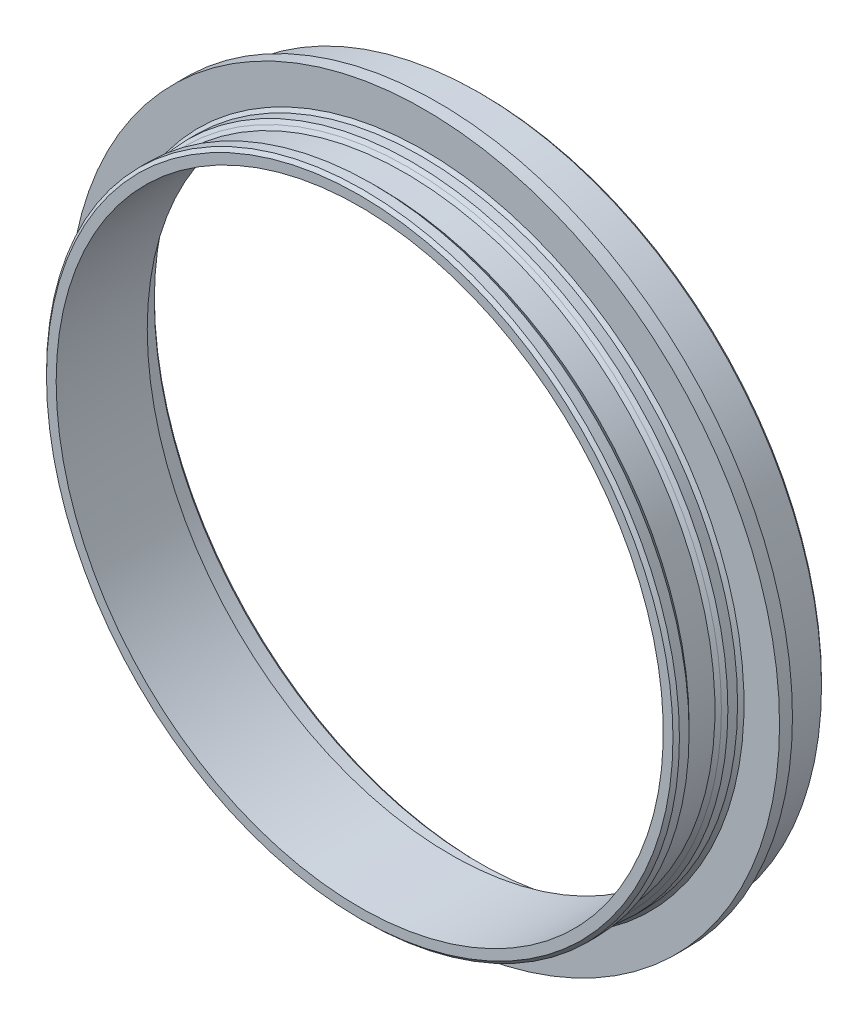
ISO-10303-21;
HEADER;
FILE_DESCRIPTION(('STEP AP214'),'2;1');
FILE_NAME('part.step','',(''),(''),'','','');
FILE_SCHEMA(('AUTOMOTIVE_DESIGN { 1 0 10303 214 1 1 1 1 }'));
ENDSEC;
DATA;
#1=APPLICATION_CONTEXT('core data for automotive mechanical design processes');
#2=APPLICATION_PROTOCOL_DEFINITION('international standard','automotive_design',2000,#1);
#3=PRODUCT_CONTEXT('',#1,'mechanical');
#4=PRODUCT('Part','Part','',(#3));
#5=PRODUCT_RELATED_PRODUCT_CATEGORY('part','',(#4));
#6=PRODUCT_DEFINITION_FORMATION('','',#4);
#7=PRODUCT_DEFINITION_CONTEXT('part definition',#1,'design');
#8=PRODUCT_DEFINITION('design','',#6,#7);
#9=PRODUCT_DEFINITION_SHAPE('','',#8);
#10=(LENGTH_UNIT() NAMED_UNIT(*) SI_UNIT(.MILLI.,.METRE.));
#11=(NAMED_UNIT(*) PLANE_ANGLE_UNIT() SI_UNIT($,.RADIAN.));
#12=(NAMED_UNIT(*) SI_UNIT($,.STERADIAN.) SOLID_ANGLE_UNIT());
#13=UNCERTAINTY_MEASURE_WITH_UNIT(LENGTH_MEASURE(1.E-05),#10,'distance_accuracy_value','');
#14=(GEOMETRIC_REPRESENTATION_CONTEXT(3) GLOBAL_UNCERTAINTY_ASSIGNED_CONTEXT((#13)) GLOBAL_UNIT_ASSIGNED_CONTEXT((#10,
#11,#12)) REPRESENTATION_CONTEXT('',''));
#15=CARTESIAN_POINT('',(0.,0.,0.));
#16=DIRECTION('',(0.,0.,1.));
#17=DIRECTION('',(1.,0.,0.));
#18=AXIS2_PLACEMENT_3D('',#15,#16,#17);
#19=CARTESIAN_POINT('',(53.,0.,-19.));
#20=DIRECTION('',(0.,0.,1.));
#21=DIRECTION('',(1.,0.,0.));
#22=AXIS2_PLACEMENT_3D('',#19,#20,#21);
#23=PLANE('',#22);
#24=CARTESIAN_POINT('',(0.,0.,-19.));
#25=DIRECTION('',(0.,0.,1.));
#26=DIRECTION('',(1.,0.,0.));
#27=AXIS2_PLACEMENT_3D('',#24,#25,#26);
#28=CIRCLE('',#27,52.5);
#29=CARTESIAN_POINT('',(52.5,0.,-19.));
#30=VERTEX_POINT('',#29);
#31=EDGE_CURVE('E50',#30,#30,#28,.F.);
#32=ORIENTED_EDGE('',*,*,#31,.T.);
#33=EDGE_LOOP('',(#32));
#34=FACE_BOUND('',#33,.T.);
#35=CARTESIAN_POINT('',(0.,0.,-19.));
#36=DIRECTION('',(0.,0.,1.));
#37=DIRECTION('',(1.,0.,0.));
#38=AXIS2_PLACEMENT_3D('',#35,#36,#37);
#39=CIRCLE('',#38,50.8);
#40=CARTESIAN_POINT('',(50.8,0.,-19.));
#41=VERTEX_POINT('',#40);
#42=EDGE_CURVE('E131',#41,#41,#39,.T.);
#43=ORIENTED_EDGE('',*,*,#42,.T.);
#44=EDGE_LOOP('',(#43));
#45=FACE_BOUND('',#44,.T.);
#46=ADVANCED_FACE('F37',(#34,#45),#23,.F.);
#47=CARTESIAN_POINT('',(0.,0.,-69.1698473282442));
#48=DIRECTION('',(0.,0.,-1.));
#49=DIRECTION('',(-1.,0.,0.));
#50=AXIS2_PLACEMENT_3D('',#47,#48,#49);
#51=CYLINDRICAL_SURFACE('',#50,50.3);
#52=CARTESIAN_POINT('',(0.,0.,-18.5));
#53=DIRECTION('',(0.,0.,1.));
#54=DIRECTION('',(1.,0.,0.));
#55=AXIS2_PLACEMENT_3D('',#52,#53,#54);
#56=CIRCLE('',#55,50.3);
#57=CARTESIAN_POINT('',(50.3,0.,-18.5));
#58=VERTEX_POINT('',#57);
#59=EDGE_CURVE('E10',#58,#58,#56,.F.);
#60=ORIENTED_EDGE('',*,*,#59,.T.);
#61=EDGE_LOOP('',(#60));
#62=FACE_BOUND('',#61,.T.);
#63=CARTESIAN_POINT('',(0.,0.,-14.1));
#64=DIRECTION('',(0.,0.,-1.));
#65=DIRECTION('',(-1.,0.,0.));
#66=AXIS2_PLACEMENT_3D('',#63,#64,#65);
#67=CIRCLE('',#66,50.3);
#68=CARTESIAN_POINT('',(-50.3,0.,-14.1));
#69=VERTEX_POINT('',#68);
#70=EDGE_CURVE('E167',#69,#69,#67,.T.);
#71=ORIENTED_EDGE('',*,*,#70,.F.);
#72=EDGE_LOOP('',(#71));
#73=FACE_BOUND('',#72,.T.);
#74=ADVANCED_FACE('F82',(#62,#73),#51,.F.);
#75=CARTESIAN_POINT('',(50.3,0.,-14.1));
#76=DIRECTION('',(0.,0.,1.));
#77=DIRECTION('',(1.,0.,0.));
#78=AXIS2_PLACEMENT_3D('',#75,#76,#77);
#79=PLANE('',#78);
#80=CARTESIAN_POINT('',(0.,0.,-14.1));
#81=DIRECTION('',(0.,0.,-1.));
#82=DIRECTION('',(-1.,0.,0.));
#83=AXIS2_PLACEMENT_3D('',#80,#81,#82);
#84=CIRCLE('',#83,47.);
#85=CARTESIAN_POINT('',(-47.,0.,-14.1));
#86=VERTEX_POINT('',#85);
#87=EDGE_CURVE('E164',#86,#86,#84,.T.);
#88=ORIENTED_EDGE('',*,*,#87,.F.);
#89=EDGE_LOOP('',(#88));
#90=FACE_BOUND('',#89,.T.);
#91=ORIENTED_EDGE('',*,*,#70,.T.);
#92=EDGE_LOOP('',(#91));
#93=FACE_BOUND('',#92,.T.);
#94=ADVANCED_FACE('F88',(#90,#93),#79,.F.);
#95=CARTESIAN_POINT('',(0.,0.,-69.1698473282442));
#96=DIRECTION('',(0.,0.,-1.));
#97=DIRECTION('',(-1.,0.,0.));
#98=AXIS2_PLACEMENT_3D('',#95,#96,#97);
#99=CYLINDRICAL_SURFACE('',#98,47.);
#100=CARTESIAN_POINT('',(0.,0.,0.));
#101=DIRECTION('',(0.,0.,-1.));
#102=DIRECTION('',(-1.,0.,0.));
#103=AXIS2_PLACEMENT_3D('',#100,#101,#102);
#104=CIRCLE('',#103,47.);
#105=CARTESIAN_POINT('',(-47.,0.,0.));
#106=VERTEX_POINT('',#105);
#107=EDGE_CURVE('E159',#106,#106,#104,.T.);
#108=ORIENTED_EDGE('',*,*,#107,.F.);
#109=EDGE_LOOP('',(#108));
#110=FACE_BOUND('',#109,.T.);
#111=ORIENTED_EDGE('',*,*,#87,.T.);
#112=EDGE_LOOP('',(#111));
#113=FACE_BOUND('',#112,.T.);
#114=ADVANCED_FACE('F197',(#110,#113),#99,.F.);
#115=CARTESIAN_POINT('',(47.,0.,0.));
#116=DIRECTION('',(0.,0.,-1.));
#117=DIRECTION('',(-1.,0.,0.));
#118=AXIS2_PLACEMENT_3D('',#115,#116,#117);
#119=PLANE('',#118);
#120=CARTESIAN_POINT('',(0.,0.,0.));
#121=DIRECTION('',(0.,0.,-1.));
#122=DIRECTION('',(-1.,0.,0.));
#123=AXIS2_PLACEMENT_3D('',#120,#121,#122);
#124=CIRCLE('',#123,48.5);
#125=CARTESIAN_POINT('',(-48.5,0.,0.));
#126=VERTEX_POINT('',#125);
#127=EDGE_CURVE('E116',#126,#126,#124,.F.);
#128=ORIENTED_EDGE('',*,*,#127,.T.);
#129=EDGE_LOOP('',(#128));
#130=FACE_BOUND('',#129,.T.);
#131=ORIENTED_EDGE('',*,*,#107,.T.);
#132=EDGE_LOOP('',(#131));
#133=FACE_BOUND('',#132,.T.);
#134=ADVANCED_FACE('F193',(#130,#133),#119,.F.);
#135=CARTESIAN_POINT('',(0.,0.,-69.1698473282442));
#136=DIRECTION('',(0.,0.,-1.));
#137=DIRECTION('',(-1.,0.,0.));
#138=AXIS2_PLACEMENT_3D('',#135,#136,#137);
#139=CYLINDRICAL_SURFACE('',#138,49.);
#140=CARTESIAN_POINT('',(0.,0.,-0.500000000000028));
#141=DIRECTION('',(0.,0.,-1.));
#142=DIRECTION('',(-1.,0.,0.));
#143=AXIS2_PLACEMENT_3D('',#140,#141,#142);
#144=CIRCLE('',#143,49.);
#145=CARTESIAN_POINT('',(-49.,0.,-0.500000000000028));
#146=VERTEX_POINT('',#145);
#147=EDGE_CURVE('E112',#146,#146,#144,.T.);
#148=ORIENTED_EDGE('',*,*,#147,.T.);
#149=EDGE_LOOP('',(#148));
#150=FACE_BOUND('',#149,.T.);
#151=CARTESIAN_POINT('',(0.,0.,-1.99999999999997));
#152=DIRECTION('',(0.,0.,1.));
#153=DIRECTION('',(1.,0.,0.));
#154=AXIS2_PLACEMENT_3D('',#151,#152,#153);
#155=CIRCLE('',#154,49.);
#156=CARTESIAN_POINT('',(49.,0.,-1.99999999999997));
#157=VERTEX_POINT('',#156);
#158=EDGE_CURVE('E110',#157,#157,#155,.T.);
#159=ORIENTED_EDGE('',*,*,#158,.T.);
#160=EDGE_LOOP('',(#159));
#161=FACE_BOUND('',#160,.T.);
#162=ADVANCED_FACE('F186',(#150,#161),#139,.T.);
#163=CARTESIAN_POINT('',(0.,0.,-69.1698473282442));
#164=DIRECTION('',(0.,0.,-1.));
#165=DIRECTION('',(-1.,0.,0.));
#166=AXIS2_PLACEMENT_3D('',#163,#164,#165);
#167=CYLINDRICAL_SURFACE('',#166,48.);
#168=CARTESIAN_POINT('',(0.,0.,-2.99999999999999));
#169=DIRECTION('',(0.,0.,1.));
#170=DIRECTION('',(1.,0.,0.));
#171=AXIS2_PLACEMENT_3D('',#168,#169,#170);
#172=CIRCLE('',#171,48.);
#173=CARTESIAN_POINT('',(48.,0.,-2.99999999999999));
#174=VERTEX_POINT('',#173);
#175=EDGE_CURVE('E128',#174,#174,#172,.F.);
#176=ORIENTED_EDGE('',*,*,#175,.T.);
#177=EDGE_LOOP('',(#176));
#178=FACE_BOUND('',#177,.T.);
#179=CARTESIAN_POINT('',(0.,0.,-7.00000000000003));
#180=DIRECTION('',(0.,0.,-1.));
#181=DIRECTION('',(-1.,0.,0.));
#182=AXIS2_PLACEMENT_3D('',#179,#180,#181);
#183=CIRCLE('',#182,48.);
#184=CARTESIAN_POINT('',(-48.,0.,-7.00000000000003));
#185=VERTEX_POINT('',#184);
#186=EDGE_CURVE('E125',#185,#185,#183,.F.);
#187=ORIENTED_EDGE('',*,*,#186,.T.);
#188=EDGE_LOOP('',(#187));
#189=FACE_BOUND('',#188,.T.);
#190=ADVANCED_FACE('F177',(#178,#189),#167,.T.);
#191=CARTESIAN_POINT('',(0.,0.,-69.1698473282442));
#192=DIRECTION('',(0.,0.,-1.));
#193=DIRECTION('',(-1.,0.,0.));
#194=AXIS2_PLACEMENT_3D('',#191,#192,#193);
#195=CYLINDRICAL_SURFACE('',#194,49.);
#196=CARTESIAN_POINT('',(0.,0.,-9.50000000000002));
#197=DIRECTION('',(0.,0.,-1.));
#198=DIRECTION('',(-1.,0.,0.));
#199=AXIS2_PLACEMENT_3D('',#196,#197,#198);
#200=CIRCLE('',#199,49.);
#201=CARTESIAN_POINT('',(-49.,0.,-9.50000000000002));
#202=VERTEX_POINT('',#201);
#203=EDGE_CURVE('E113',#202,#202,#200,.F.);
#204=ORIENTED_EDGE('',*,*,#203,.T.);
#205=EDGE_LOOP('',(#204));
#206=FACE_BOUND('',#205,.T.);
#207=CARTESIAN_POINT('',(0.,0.,-7.99999999999999));
#208=DIRECTION('',(0.,0.,-1.));
#209=DIRECTION('',(-1.,0.,0.));
#210=AXIS2_PLACEMENT_3D('',#207,#208,#209);
#211=CIRCLE('',#210,49.);
#212=CARTESIAN_POINT('',(-49.,0.,-7.99999999999999));
#213=VERTEX_POINT('',#212);
#214=EDGE_CURVE('E119',#213,#213,#211,.T.);
#215=ORIENTED_EDGE('',*,*,#214,.T.);
#216=EDGE_LOOP('',(#215));
#217=FACE_BOUND('',#216,.T.);
#218=ADVANCED_FACE('F174',(#206,#217),#195,.T.);
#219=CARTESIAN_POINT('',(49.,0.,-10.));
#220=DIRECTION('',(0.,0.,-1.));
#221=DIRECTION('',(-1.,0.,0.));
#222=AXIS2_PLACEMENT_3D('',#219,#220,#221);
#223=PLANE('',#222);
#224=CARTESIAN_POINT('',(0.,0.,-10.));
#225=DIRECTION('',(0.,0.,-1.));
#226=DIRECTION('',(-1.,0.,0.));
#227=AXIS2_PLACEMENT_3D('',#224,#225,#226);
#228=CIRCLE('',#227,49.5);
#229=CARTESIAN_POINT('',(-49.5,0.,-10.));
#230=VERTEX_POINT('',#229);
#231=EDGE_CURVE('E170',#230,#230,#228,.T.);
#232=ORIENTED_EDGE('',*,*,#231,.T.);
#233=EDGE_LOOP('',(#232));
#234=FACE_BOUND('',#233,.T.);
#235=CARTESIAN_POINT('',(0.,0.,-10.));
#236=DIRECTION('',(0.,0.,-1.));
#237=DIRECTION('',(-1.,0.,0.));
#238=AXIS2_PLACEMENT_3D('',#235,#236,#237);
#239=CIRCLE('',#238,55.);
#240=CARTESIAN_POINT('',(-55.,0.,-10.));
#241=VERTEX_POINT('',#240);
#242=EDGE_CURVE('E156',#241,#241,#239,.T.);
#243=ORIENTED_EDGE('',*,*,#242,.F.);
#244=EDGE_LOOP('',(#243));
#245=FACE_BOUND('',#244,.T.);
#246=ADVANCED_FACE('F176',(#234,#245),#223,.F.);
#247=CARTESIAN_POINT('',(0.,0.,-69.1698473282442));
#248=DIRECTION('',(0.,0.,-1.));
#249=DIRECTION('',(-1.,0.,0.));
#250=AXIS2_PLACEMENT_3D('',#247,#248,#249);
#251=CYLINDRICAL_SURFACE('',#250,55.);
#252=CARTESIAN_POINT('',(0.,0.,-12.));
#253=DIRECTION('',(0.,0.,-1.));
#254=DIRECTION('',(-1.,0.,0.));
#255=AXIS2_PLACEMENT_3D('',#252,#253,#254);
#256=CIRCLE('',#255,55.);
#257=CARTESIAN_POINT('',(-55.,0.,-12.));
#258=VERTEX_POINT('',#257);
#259=EDGE_CURVE('E59',#258,#258,#256,.T.);
#260=ORIENTED_EDGE('',*,*,#259,.F.);
#261=EDGE_LOOP('',(#260));
#262=FACE_BOUND('',#261,.T.);
#263=ORIENTED_EDGE('',*,*,#242,.T.);
#264=EDGE_LOOP('',(#263));
#265=FACE_BOUND('',#264,.T.);
#266=ADVANCED_FACE('F151',(#262,#265),#251,.T.);
#267=CARTESIAN_POINT('',(55.,0.,-12.));
#268=DIRECTION('',(0.,0.,1.));
#269=DIRECTION('',(1.,0.,0.));
#270=AXIS2_PLACEMENT_3D('',#267,#268,#269);
#271=PLANE('',#270);
#272=CARTESIAN_POINT('',(0.,0.,-12.));
#273=DIRECTION('',(0.,0.,-1.));
#274=DIRECTION('',(-1.,0.,0.));
#275=AXIS2_PLACEMENT_3D('',#272,#273,#274);
#276=CIRCLE('',#275,53.);
#277=CARTESIAN_POINT('',(-53.,0.,-12.));
#278=VERTEX_POINT('',#277);
#279=EDGE_CURVE('E55',#278,#278,#276,.T.);
#280=ORIENTED_EDGE('',*,*,#279,.F.);
#281=EDGE_LOOP('',(#280));
#282=FACE_BOUND('',#281,.T.);
#283=ORIENTED_EDGE('',*,*,#259,.T.);
#284=EDGE_LOOP('',(#283));
#285=FACE_BOUND('',#284,.T.);
#286=ADVANCED_FACE('F145',(#282,#285),#271,.F.);
#287=CARTESIAN_POINT('',(0.,0.,-69.1698473282442));
#288=DIRECTION('',(0.,0.,-1.));
#289=DIRECTION('',(-1.,0.,0.));
#290=AXIS2_PLACEMENT_3D('',#287,#288,#289);
#291=CYLINDRICAL_SURFACE('',#290,53.);
#292=CARTESIAN_POINT('',(0.,0.,-18.5));
#293=DIRECTION('',(0.,0.,1.));
#294=DIRECTION('',(1.,0.,0.));
#295=AXIS2_PLACEMENT_3D('',#292,#293,#294);
#296=CIRCLE('',#295,53.);
#297=CARTESIAN_POINT('',(53.,0.,-18.5));
#298=VERTEX_POINT('',#297);
#299=EDGE_CURVE('E45',#298,#298,#296,.T.);
#300=ORIENTED_EDGE('',*,*,#299,.T.);
#301=EDGE_LOOP('',(#300));
#302=FACE_BOUND('',#301,.T.);
#303=ORIENTED_EDGE('',*,*,#279,.T.);
#304=EDGE_LOOP('',(#303));
#305=FACE_BOUND('',#304,.T.);
#306=ADVANCED_FACE('F98',(#302,#305),#291,.T.);
#307=CARTESIAN_POINT('',(0.,0.,-10.));
#308=DIRECTION('',(0.,0.,-1.));
#309=DIRECTION('',(-1.,0.,0.));
#310=AXIS2_PLACEMENT_3D('',#307,#308,#309);
#311=CONICAL_SURFACE('',#310,49.5,0.785398163397455);
#312=ORIENTED_EDGE('',*,*,#203,.F.);
#313=EDGE_LOOP('',(#312));
#314=FACE_BOUND('',#313,.T.);
#315=ORIENTED_EDGE('',*,*,#231,.F.);
#316=EDGE_LOOP('',(#315));
#317=FACE_BOUND('',#316,.T.);
#318=ADVANCED_FACE('F94',(#314,#317),#311,.T.);
#319=CARTESIAN_POINT('',(0.,0.,-0.500000000000028));
#320=DIRECTION('',(0.,0.,-1.));
#321=DIRECTION('',(-1.,0.,0.));
#322=AXIS2_PLACEMENT_3D('',#319,#320,#321);
#323=CONICAL_SURFACE('',#322,49.,0.785398163397448);
#324=ORIENTED_EDGE('',*,*,#127,.F.);
#325=EDGE_LOOP('',(#324));
#326=FACE_BOUND('',#325,.T.);
#327=ORIENTED_EDGE('',*,*,#147,.F.);
#328=EDGE_LOOP('',(#327));
#329=FACE_BOUND('',#328,.T.);
#330=ADVANCED_FACE('F97',(#326,#329),#323,.T.);
#331=CARTESIAN_POINT('',(0.,0.,-2.5));
#332=DIRECTION('',(0.,0.,1.));
#333=DIRECTION('',(1.,0.,0.));
#334=AXIS2_PLACEMENT_3D('',#331,#332,#333);
#335=CONICAL_SURFACE('',#334,48.5,0.785398163397455);
#336=ORIENTED_EDGE('',*,*,#158,.F.);
#337=EDGE_LOOP('',(#336));
#338=FACE_BOUND('',#337,.T.);
#339=CARTESIAN_POINT('',(0.,0.,-2.5));
#340=DIRECTION('',(0.,0.,1.));
#341=DIRECTION('',(1.,0.,0.));
#342=AXIS2_PLACEMENT_3D('',#339,#340,#341);
#343=CIRCLE('',#342,48.5);
#344=CARTESIAN_POINT('',(48.5,0.,-2.5));
#345=VERTEX_POINT('',#344);
#346=EDGE_CURVE('E53',#345,#345,#343,.F.);
#347=ORIENTED_EDGE('',*,*,#346,.F.);
#348=EDGE_LOOP('',(#347));
#349=FACE_BOUND('',#348,.T.);
#350=ADVANCED_FACE('F78',(#338,#349),#335,.T.);
#351=CARTESIAN_POINT('',(0.,0.,-2.99999999999999));
#352=DIRECTION('',(0.,0.,1.));
#353=DIRECTION('',(1.,0.,0.));
#354=AXIS2_PLACEMENT_3D('',#351,#352,#353);
#355=CONICAL_SURFACE('',#354,48.,0.785398163397455);
#356=ORIENTED_EDGE('',*,*,#346,.T.);
#357=EDGE_LOOP('',(#356));
#358=FACE_BOUND('',#357,.T.);
#359=ORIENTED_EDGE('',*,*,#175,.F.);
#360=EDGE_LOOP('',(#359));
#361=FACE_BOUND('',#360,.T.);
#362=ADVANCED_FACE('F68',(#358,#361),#355,.T.);
#363=CARTESIAN_POINT('',(0.,0.,-7.99999999999999));
#364=DIRECTION('',(0.,0.,-1.));
#365=DIRECTION('',(-1.,0.,0.));
#366=AXIS2_PLACEMENT_3D('',#363,#364,#365);
#367=CONICAL_SURFACE('',#366,49.,0.785398163397448);
#368=ORIENTED_EDGE('',*,*,#214,.F.);
#369=EDGE_LOOP('',(#368));
#370=FACE_BOUND('',#369,.T.);
#371=CARTESIAN_POINT('',(0.,0.,-7.5));
#372=DIRECTION('',(0.,0.,-1.));
#373=DIRECTION('',(-1.,0.,0.));
#374=AXIS2_PLACEMENT_3D('',#371,#372,#373);
#375=CIRCLE('',#374,48.5);
#376=CARTESIAN_POINT('',(-48.5,0.,-7.5));
#377=VERTEX_POINT('',#376);
#378=EDGE_CURVE('E41',#377,#377,#375,.F.);
#379=ORIENTED_EDGE('',*,*,#378,.F.);
#380=EDGE_LOOP('',(#379));
#381=FACE_BOUND('',#380,.T.);
#382=ADVANCED_FACE('F66',(#370,#381),#367,.T.);
#383=CARTESIAN_POINT('',(0.,0.,-7.50000000000001));
#384=DIRECTION('',(0.,0.,-1.));
#385=DIRECTION('',(-1.,0.,0.));
#386=AXIS2_PLACEMENT_3D('',#383,#384,#385);
#387=CONICAL_SURFACE('',#386,48.5,0.785398163397455);
#388=ORIENTED_EDGE('',*,*,#186,.F.);
#389=EDGE_LOOP('',(#388));
#390=FACE_BOUND('',#389,.T.);
#391=ORIENTED_EDGE('',*,*,#378,.T.);
#392=EDGE_LOOP('',(#391));
#393=FACE_BOUND('',#392,.T.);
#394=ADVANCED_FACE('F64',(#390,#393),#387,.T.);
#395=CARTESIAN_POINT('',(0.,0.,-19.));
#396=DIRECTION('',(0.,0.,1.));
#397=DIRECTION('',(1.,0.,0.));
#398=AXIS2_PLACEMENT_3D('',#395,#396,#397);
#399=CONICAL_SURFACE('',#398,52.5,0.785398163397435);
#400=ORIENTED_EDGE('',*,*,#299,.F.);
#401=EDGE_LOOP('',(#400));
#402=FACE_BOUND('',#401,.T.);
#403=ORIENTED_EDGE('',*,*,#31,.F.);
#404=EDGE_LOOP('',(#403));
#405=FACE_BOUND('',#404,.T.);
#406=ADVANCED_FACE('F75',(#402,#405),#399,.T.);
#407=CARTESIAN_POINT('',(0.,0.,-18.5));
#408=DIRECTION('',(0.,0.,-1.));
#409=DIRECTION('',(-1.,0.,0.));
#410=AXIS2_PLACEMENT_3D('',#407,#408,#409);
#411=CONICAL_SURFACE('',#410,50.3,0.785398163397434);
#412=ORIENTED_EDGE('',*,*,#42,.F.);
#413=EDGE_LOOP('',(#412));
#414=FACE_BOUND('',#413,.T.);
#415=ORIENTED_EDGE('',*,*,#59,.F.);
#416=EDGE_LOOP('',(#415));
#417=FACE_BOUND('',#416,.T.);
#418=ADVANCED_FACE('F39',(#414,#417),#411,.F.);
#419=CLOSED_SHELL('',(#46,#74,#94,#114,#134,#162,#190,#218,#246,#266,#286,#306,#318,#330,#350,
#362,#382,#394,#406,#418));
#420=MANIFOLD_SOLID_BREP('B2',#419);
#421=ADVANCED_BREP_SHAPE_REPRESENTATION('',(#18,#420),#14);
#422=SHAPE_DEFINITION_REPRESENTATION(#9,#421);
ENDSEC;
END-ISO-10303-21;
